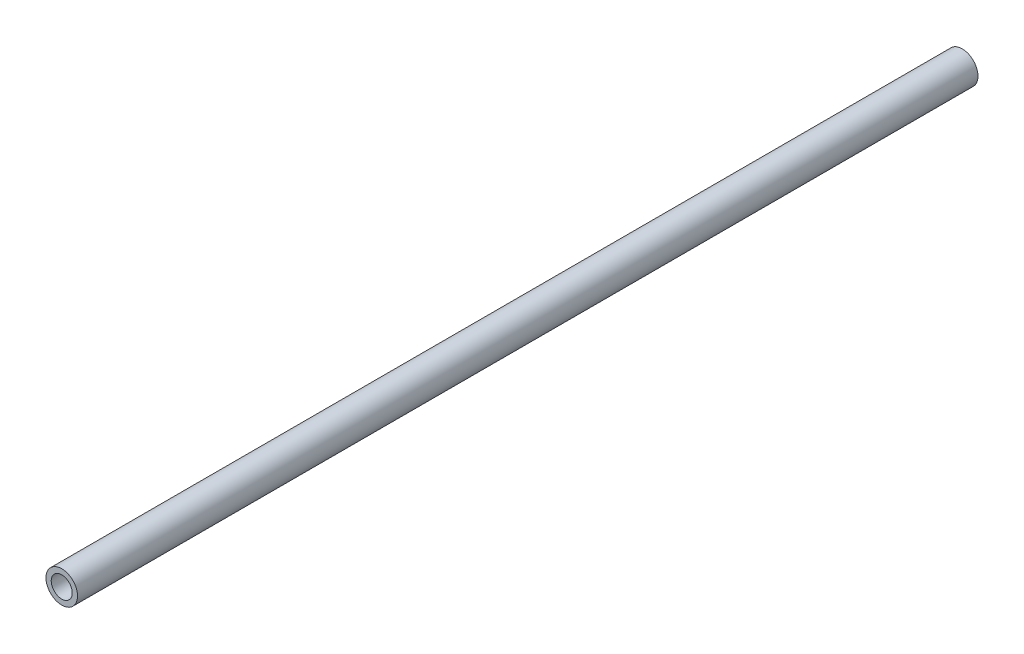
ISO-10303-21;
HEADER;
FILE_DESCRIPTION(('STEP AP214'),'2;1');
FILE_NAME('part.step','',(''),(''),'','','');
FILE_SCHEMA(('AUTOMOTIVE_DESIGN { 1 0 10303 214 1 1 1 1 }'));
ENDSEC;
DATA;
#1=APPLICATION_CONTEXT('core data for automotive mechanical design processes');
#2=APPLICATION_PROTOCOL_DEFINITION('international standard','automotive_design',2000,#1);
#3=PRODUCT_CONTEXT('',#1,'mechanical');
#4=PRODUCT('Part','Part','',(#3));
#5=PRODUCT_RELATED_PRODUCT_CATEGORY('part','',(#4));
#6=PRODUCT_DEFINITION_FORMATION('','',#4);
#7=PRODUCT_DEFINITION_CONTEXT('part definition',#1,'design');
#8=PRODUCT_DEFINITION('design','',#6,#7);
#9=PRODUCT_DEFINITION_SHAPE('','',#8);
#10=(LENGTH_UNIT() NAMED_UNIT(*) SI_UNIT(.MILLI.,.METRE.));
#11=(NAMED_UNIT(*) PLANE_ANGLE_UNIT() SI_UNIT($,.RADIAN.));
#12=(NAMED_UNIT(*) SI_UNIT($,.STERADIAN.) SOLID_ANGLE_UNIT());
#13=UNCERTAINTY_MEASURE_WITH_UNIT(LENGTH_MEASURE(1.E-05),#10,'distance_accuracy_value','');
#14=(GEOMETRIC_REPRESENTATION_CONTEXT(3) GLOBAL_UNCERTAINTY_ASSIGNED_CONTEXT((#13)) GLOBAL_UNIT_ASSIGNED_CONTEXT((#10,
#11,#12)) REPRESENTATION_CONTEXT('',''));
#15=CARTESIAN_POINT('',(0.,0.,0.));
#16=DIRECTION('',(0.,0.,1.));
#17=DIRECTION('',(1.,0.,0.));
#18=AXIS2_PLACEMENT_3D('',#15,#16,#17);
#19=CARTESIAN_POINT('',(0.,0.,-543.75));
#20=DIRECTION('',(0.,0.,1.));
#21=DIRECTION('',(1.,0.,0.));
#22=AXIS2_PLACEMENT_3D('',#19,#20,#21);
#23=CYLINDRICAL_SURFACE('',#22,9.525);
#24=CARTESIAN_POINT('',(0.,0.,-543.75));
#25=DIRECTION('',(0.,0.,1.));
#26=DIRECTION('',(1.,0.,0.));
#27=AXIS2_PLACEMENT_3D('',#24,#25,#26);
#28=CIRCLE('',#27,9.525);
#29=CARTESIAN_POINT('',(9.525,0.,-543.75));
#30=VERTEX_POINT('',#29);
#31=EDGE_CURVE('E10',#30,#30,#28,.T.);
#32=ORIENTED_EDGE('',*,*,#31,.T.);
#33=EDGE_LOOP('',(#32));
#34=FACE_BOUND('',#33,.T.);
#35=CARTESIAN_POINT('',(0.,0.,0.));
#36=DIRECTION('',(0.,0.,1.));
#37=DIRECTION('',(1.,0.,0.));
#38=AXIS2_PLACEMENT_3D('',#35,#36,#37);
#39=CIRCLE('',#38,9.525);
#40=CARTESIAN_POINT('',(9.525,0.,0.));
#41=VERTEX_POINT('',#40);
#42=EDGE_CURVE('E40',#41,#41,#39,.T.);
#43=ORIENTED_EDGE('',*,*,#42,.F.);
#44=EDGE_LOOP('',(#43));
#45=FACE_BOUND('',#44,.T.);
#46=ADVANCED_FACE('F37',(#34,#45),#23,.T.);
#47=CARTESIAN_POINT('',(0.,0.,-543.75));
#48=DIRECTION('',(0.,0.,1.));
#49=DIRECTION('',(1.,0.,0.));
#50=AXIS2_PLACEMENT_3D('',#47,#48,#49);
#51=PLANE('',#50);
#52=CARTESIAN_POINT('',(0.,0.,-543.75));
#53=DIRECTION('',(0.,0.,1.));
#54=DIRECTION('',(1.,0.,0.));
#55=AXIS2_PLACEMENT_3D('',#52,#53,#54);
#56=CIRCLE('',#55,6.35);
#57=CARTESIAN_POINT('',(6.35,0.,-543.75));
#58=VERTEX_POINT('',#57);
#59=EDGE_CURVE('E47',#58,#58,#56,.T.);
#60=ORIENTED_EDGE('',*,*,#59,.T.);
#61=EDGE_LOOP('',(#60));
#62=FACE_BOUND('',#61,.T.);
#63=ORIENTED_EDGE('',*,*,#31,.F.);
#64=EDGE_LOOP('',(#63));
#65=FACE_BOUND('',#64,.T.);
#66=ADVANCED_FACE('F55',(#62,#65),#51,.F.);
#67=CARTESIAN_POINT('',(0.,0.,0.));
#68=DIRECTION('',(0.,0.,1.));
#69=DIRECTION('',(1.,0.,0.));
#70=AXIS2_PLACEMENT_3D('',#67,#68,#69);
#71=PLANE('',#70);
#72=CARTESIAN_POINT('',(0.,0.,0.));
#73=DIRECTION('',(0.,0.,1.));
#74=DIRECTION('',(1.,0.,0.));
#75=AXIS2_PLACEMENT_3D('',#72,#73,#74);
#76=CIRCLE('',#75,6.35);
#77=CARTESIAN_POINT('',(6.35,0.,0.));
#78=VERTEX_POINT('',#77);
#79=EDGE_CURVE('E49',#78,#78,#76,.T.);
#80=ORIENTED_EDGE('',*,*,#79,.F.);
#81=EDGE_LOOP('',(#80));
#82=FACE_BOUND('',#81,.T.);
#83=ORIENTED_EDGE('',*,*,#42,.T.);
#84=EDGE_LOOP('',(#83));
#85=FACE_BOUND('',#84,.T.);
#86=ADVANCED_FACE('F61',(#82,#85),#71,.T.);
#87=CARTESIAN_POINT('',(0.,0.,-543.75));
#88=DIRECTION('',(0.,0.,1.));
#89=DIRECTION('',(1.,0.,0.));
#90=AXIS2_PLACEMENT_3D('',#87,#88,#89);
#91=CYLINDRICAL_SURFACE('',#90,6.35);
#92=ORIENTED_EDGE('',*,*,#59,.F.);
#93=EDGE_LOOP('',(#92));
#94=FACE_BOUND('',#93,.T.);
#95=ORIENTED_EDGE('',*,*,#79,.T.);
#96=EDGE_LOOP('',(#95));
#97=FACE_BOUND('',#96,.T.);
#98=ADVANCED_FACE('F58',(#94,#97),#91,.F.);
#99=CLOSED_SHELL('',(#46,#66,#86,#98));
#100=MANIFOLD_SOLID_BREP('B2',#99);
#101=ADVANCED_BREP_SHAPE_REPRESENTATION('',(#18,#100),#14);
#102=SHAPE_DEFINITION_REPRESENTATION(#9,#101);
ENDSEC;
END-ISO-10303-21;
